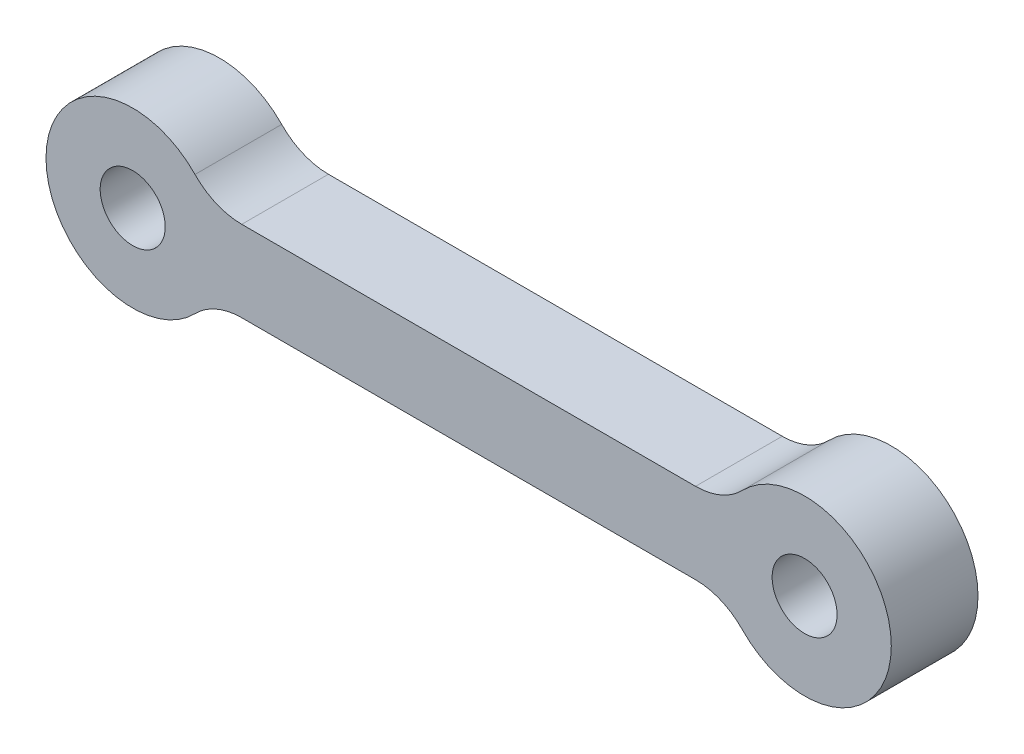
ISO-10303-21;
HEADER;
FILE_DESCRIPTION(('STEP AP214'),'2;1');
FILE_NAME('part.step','',(''),(''),'','','');
FILE_SCHEMA(('AUTOMOTIVE_DESIGN { 1 0 10303 214 1 1 1 1 }'));
ENDSEC;
DATA;
#1=APPLICATION_CONTEXT('core data for automotive mechanical design processes');
#2=APPLICATION_PROTOCOL_DEFINITION('international standard','automotive_design',2000,#1);
#3=PRODUCT_CONTEXT('',#1,'mechanical');
#4=PRODUCT('Part','Part','',(#3));
#5=PRODUCT_RELATED_PRODUCT_CATEGORY('part','',(#4));
#6=PRODUCT_DEFINITION_FORMATION('','',#4);
#7=PRODUCT_DEFINITION_CONTEXT('part definition',#1,'design');
#8=PRODUCT_DEFINITION('design','',#6,#7);
#9=PRODUCT_DEFINITION_SHAPE('','',#8);
#10=(LENGTH_UNIT() NAMED_UNIT(*) SI_UNIT(.MILLI.,.METRE.));
#11=(NAMED_UNIT(*) PLANE_ANGLE_UNIT() SI_UNIT($,.RADIAN.));
#12=(NAMED_UNIT(*) SI_UNIT($,.STERADIAN.) SOLID_ANGLE_UNIT());
#13=UNCERTAINTY_MEASURE_WITH_UNIT(LENGTH_MEASURE(1.E-05),#10,'distance_accuracy_value','');
#14=(GEOMETRIC_REPRESENTATION_CONTEXT(3) GLOBAL_UNCERTAINTY_ASSIGNED_CONTEXT((#13)) GLOBAL_UNIT_ASSIGNED_CONTEXT((#10,
#11,#12)) REPRESENTATION_CONTEXT('',''));
#15=CARTESIAN_POINT('',(0.,0.,0.));
#16=DIRECTION('',(0.,0.,1.));
#17=DIRECTION('',(1.,0.,0.));
#18=AXIS2_PLACEMENT_3D('',#15,#16,#17);
#19=CARTESIAN_POINT('',(10.4687938216451,4.86692555838731,4.));
#20=DIRECTION('',(0.,0.,1.));
#21=DIRECTION('',(1.,0.,0.));
#22=AXIS2_PLACEMENT_3D('',#19,#20,#21);
#23=PLANE('',#22);
#24=CARTESIAN_POINT('',(-15.5,0.,4.));
#25=DIRECTION('',(0.,0.,1.));
#26=DIRECTION('',(1.,0.,0.));
#27=AXIS2_PLACEMENT_3D('',#24,#25,#26);
#28=CIRCLE('',#27,1.5);
#29=CARTESIAN_POINT('',(-14.,0.,4.));
#30=VERTEX_POINT('',#29);
#31=EDGE_CURVE('E141',#30,#30,#28,.T.);
#32=ORIENTED_EDGE('',*,*,#31,.F.);
#33=EDGE_LOOP('',(#32));
#34=FACE_BOUND('',#33,.T.);
#35=CARTESIAN_POINT('',(10.4687938216451,4.86692555838731,4.));
#36=DIRECTION('',(0.,0.,-1.));
#37=DIRECTION('',(1.,0.,0.));
#38=AXIS2_PLACEMENT_3D('',#35,#36,#37);
#39=CIRCLE('',#38,3.);
#40=CARTESIAN_POINT('',(12.6250250409401,2.78110031907846,4.));
#41=VERTEX_POINT('',#40);
#42=CARTESIAN_POINT('',(10.4687938216451,1.86692555838731,4.));
#43=VERTEX_POINT('',#42);
#44=EDGE_CURVE('E152',#41,#43,#39,.T.);
#45=ORIENTED_EDGE('',*,*,#44,.T.);
#46=DIRECTION('',(-1.,0.,0.));
#47=VECTOR('',#46,1.);
#48=CARTESIAN_POINT('',(-10.4687938216451,1.86692555838731,4.));
#49=LINE('',#48,#47);
#50=CARTESIAN_POINT('',(-10.4687938216451,1.86692555838731,4.));
#51=VERTEX_POINT('',#50);
#52=EDGE_CURVE('E100',#43,#51,#49,.T.);
#53=ORIENTED_EDGE('',*,*,#52,.T.);
#54=CARTESIAN_POINT('',(-10.4687938216451,4.86692555838731,4.));
#55=DIRECTION('',(0.,0.,-1.));
#56=DIRECTION('',(-1.,0.,0.));
#57=AXIS2_PLACEMENT_3D('',#54,#55,#56);
#58=CIRCLE('',#57,3.);
#59=CARTESIAN_POINT('',(-12.6250250409401,2.78110031907846,4.));
#60=VERTEX_POINT('',#59);
#61=EDGE_CURVE('E167',#51,#60,#58,.T.);
#62=ORIENTED_EDGE('',*,*,#61,.T.);
#63=CARTESIAN_POINT('',(-15.5,0.,4.));
#64=DIRECTION('',(0.,0.,1.));
#65=DIRECTION('',(1.,0.,0.));
#66=AXIS2_PLACEMENT_3D('',#63,#64,#65);
#67=CIRCLE('',#66,4.);
#68=CARTESIAN_POINT('',(-12.6250250409401,-2.78110031907846,4.));
#69=VERTEX_POINT('',#68);
#70=EDGE_CURVE('E180',#60,#69,#67,.T.);
#71=ORIENTED_EDGE('',*,*,#70,.T.);
#72=CARTESIAN_POINT('',(-10.4687938216451,-4.86692555838731,4.));
#73=DIRECTION('',(0.,0.,-1.));
#74=DIRECTION('',(-1.,0.,0.));
#75=AXIS2_PLACEMENT_3D('',#72,#73,#74);
#76=CIRCLE('',#75,3.);
#77=CARTESIAN_POINT('',(-10.4687938216451,-1.86692555838731,4.));
#78=VERTEX_POINT('',#77);
#79=EDGE_CURVE('E119',#69,#78,#76,.T.);
#80=ORIENTED_EDGE('',*,*,#79,.T.);
#81=DIRECTION('',(1.,0.,0.));
#82=VECTOR('',#81,1.);
#83=CARTESIAN_POINT('',(-10.4687938216451,-1.86692555838731,4.));
#84=LINE('',#83,#82);
#85=CARTESIAN_POINT('',(10.4687938216451,-1.86692555838731,4.));
#86=VERTEX_POINT('',#85);
#87=EDGE_CURVE('E113',#78,#86,#84,.T.);
#88=ORIENTED_EDGE('',*,*,#87,.T.);
#89=CARTESIAN_POINT('',(10.4687938216451,-4.8669255583873,4.));
#90=DIRECTION('',(0.,0.,-1.));
#91=DIRECTION('',(-1.,0.,0.));
#92=AXIS2_PLACEMENT_3D('',#89,#90,#91);
#93=CIRCLE('',#92,3.);
#94=CARTESIAN_POINT('',(12.6250250409401,-2.78110031907846,4.));
#95=VERTEX_POINT('',#94);
#96=EDGE_CURVE('E117',#86,#95,#93,.T.);
#97=ORIENTED_EDGE('',*,*,#96,.T.);
#98=CARTESIAN_POINT('',(15.5,0.,4.));
#99=DIRECTION('',(0.,0.,1.));
#100=DIRECTION('',(-1.,0.,0.));
#101=AXIS2_PLACEMENT_3D('',#98,#99,#100);
#102=CIRCLE('',#101,4.);
#103=EDGE_CURVE('E57',#95,#41,#102,.T.);
#104=ORIENTED_EDGE('',*,*,#103,.T.);
#105=EDGE_LOOP('',(#45,#53,#62,#71,#80,#88,#97,#104));
#106=FACE_BOUND('',#105,.T.);
#107=CARTESIAN_POINT('',(15.5,0.,4.));
#108=DIRECTION('',(0.,0.,1.));
#109=DIRECTION('',(-1.,0.,0.));
#110=AXIS2_PLACEMENT_3D('',#107,#108,#109);
#111=CIRCLE('',#110,1.5);
#112=CARTESIAN_POINT('',(14.,0.,4.));
#113=VERTEX_POINT('',#112);
#114=EDGE_CURVE('E189',#113,#113,#111,.T.);
#115=ORIENTED_EDGE('',*,*,#114,.F.);
#116=EDGE_LOOP('',(#115));
#117=FACE_BOUND('',#116,.T.);
#118=ADVANCED_FACE('F40',(#34,#106,#117),#23,.T.);
#119=CARTESIAN_POINT('',(10.4687938216451,4.86692555838731,0.));
#120=DIRECTION('',(0.,0.,1.));
#121=DIRECTION('',(1.,0.,0.));
#122=AXIS2_PLACEMENT_3D('',#119,#120,#121);
#123=PLANE('',#122);
#124=CARTESIAN_POINT('',(10.4687938216451,4.86692555838731,0.));
#125=DIRECTION('',(0.,0.,-1.));
#126=DIRECTION('',(1.,0.,0.));
#127=AXIS2_PLACEMENT_3D('',#124,#125,#126);
#128=CIRCLE('',#127,3.);
#129=CARTESIAN_POINT('',(12.6250250409401,2.78110031907846,0.));
#130=VERTEX_POINT('',#129);
#131=CARTESIAN_POINT('',(10.4687938216451,1.86692555838731,0.));
#132=VERTEX_POINT('',#131);
#133=EDGE_CURVE('E137',#130,#132,#128,.T.);
#134=ORIENTED_EDGE('',*,*,#133,.F.);
#135=CARTESIAN_POINT('',(15.5,0.,0.));
#136=DIRECTION('',(0.,0.,1.));
#137=DIRECTION('',(-1.,0.,0.));
#138=AXIS2_PLACEMENT_3D('',#135,#136,#137);
#139=CIRCLE('',#138,4.);
#140=CARTESIAN_POINT('',(12.6250250409401,-2.78110031907846,0.));
#141=VERTEX_POINT('',#140);
#142=EDGE_CURVE('E92',#141,#130,#139,.T.);
#143=ORIENTED_EDGE('',*,*,#142,.F.);
#144=CARTESIAN_POINT('',(10.4687938216451,-4.8669255583873,0.));
#145=DIRECTION('',(0.,0.,-1.));
#146=DIRECTION('',(-1.,0.,0.));
#147=AXIS2_PLACEMENT_3D('',#144,#145,#146);
#148=CIRCLE('',#147,3.);
#149=CARTESIAN_POINT('',(10.4687938216451,-1.86692555838731,0.));
#150=VERTEX_POINT('',#149);
#151=EDGE_CURVE('E86',#150,#141,#148,.T.);
#152=ORIENTED_EDGE('',*,*,#151,.F.);
#153=DIRECTION('',(1.,0.,0.));
#154=VECTOR('',#153,1.);
#155=CARTESIAN_POINT('',(-10.4687938216451,-1.86692555838731,0.));
#156=LINE('',#155,#154);
#157=CARTESIAN_POINT('',(-10.4687938216451,-1.86692555838731,0.));
#158=VERTEX_POINT('',#157);
#159=EDGE_CURVE('E127',#158,#150,#156,.T.);
#160=ORIENTED_EDGE('',*,*,#159,.F.);
#161=CARTESIAN_POINT('',(-10.4687938216451,-4.86692555838731,0.));
#162=DIRECTION('',(0.,0.,-1.));
#163=DIRECTION('',(-1.,0.,0.));
#164=AXIS2_PLACEMENT_3D('',#161,#162,#163);
#165=CIRCLE('',#164,3.);
#166=CARTESIAN_POINT('',(-12.6250250409401,-2.78110031907846,0.));
#167=VERTEX_POINT('',#166);
#168=EDGE_CURVE('E147',#167,#158,#165,.T.);
#169=ORIENTED_EDGE('',*,*,#168,.F.);
#170=CARTESIAN_POINT('',(-15.5,0.,0.));
#171=DIRECTION('',(0.,0.,1.));
#172=DIRECTION('',(1.,0.,0.));
#173=AXIS2_PLACEMENT_3D('',#170,#171,#172);
#174=CIRCLE('',#173,4.);
#175=CARTESIAN_POINT('',(-12.6250250409401,2.78110031907846,0.));
#176=VERTEX_POINT('',#175);
#177=EDGE_CURVE('E145',#176,#167,#174,.T.);
#178=ORIENTED_EDGE('',*,*,#177,.F.);
#179=CARTESIAN_POINT('',(-10.4687938216451,4.86692555838731,0.));
#180=DIRECTION('',(0.,0.,-1.));
#181=DIRECTION('',(-1.,0.,0.));
#182=AXIS2_PLACEMENT_3D('',#179,#180,#181);
#183=CIRCLE('',#182,3.);
#184=CARTESIAN_POINT('',(-10.4687938216451,1.86692555838731,0.));
#185=VERTEX_POINT('',#184);
#186=EDGE_CURVE('E143',#185,#176,#183,.T.);
#187=ORIENTED_EDGE('',*,*,#186,.F.);
#188=DIRECTION('',(-1.,0.,0.));
#189=VECTOR('',#188,1.);
#190=CARTESIAN_POINT('',(-10.4687938216451,1.86692555838731,0.));
#191=LINE('',#190,#189);
#192=EDGE_CURVE('E140',#132,#185,#191,.T.);
#193=ORIENTED_EDGE('',*,*,#192,.F.);
#194=EDGE_LOOP('',(#134,#143,#152,#160,#169,#178,#187,#193));
#195=FACE_BOUND('',#194,.T.);
#196=CARTESIAN_POINT('',(-15.5,0.,0.));
#197=DIRECTION('',(0.,0.,1.));
#198=DIRECTION('',(1.,0.,0.));
#199=AXIS2_PLACEMENT_3D('',#196,#197,#198);
#200=CIRCLE('',#199,1.5);
#201=CARTESIAN_POINT('',(-14.,0.,0.));
#202=VERTEX_POINT('',#201);
#203=EDGE_CURVE('E186',#202,#202,#200,.T.);
#204=ORIENTED_EDGE('',*,*,#203,.T.);
#205=EDGE_LOOP('',(#204));
#206=FACE_BOUND('',#205,.T.);
#207=CARTESIAN_POINT('',(15.5,0.,0.));
#208=DIRECTION('',(0.,0.,1.));
#209=DIRECTION('',(-1.,0.,0.));
#210=AXIS2_PLACEMENT_3D('',#207,#208,#209);
#211=CIRCLE('',#210,1.5);
#212=CARTESIAN_POINT('',(14.,0.,0.));
#213=VERTEX_POINT('',#212);
#214=EDGE_CURVE('E192',#213,#213,#211,.T.);
#215=ORIENTED_EDGE('',*,*,#214,.T.);
#216=EDGE_LOOP('',(#215));
#217=FACE_BOUND('',#216,.T.);
#218=ADVANCED_FACE('F171',(#195,#206,#217),#123,.F.);
#219=CARTESIAN_POINT('',(10.4687938216451,4.86692555838731,4.));
#220=DIRECTION('',(0.,0.,-1.));
#221=DIRECTION('',(-1.,0.,0.));
#222=AXIS2_PLACEMENT_3D('',#219,#220,#221);
#223=CYLINDRICAL_SURFACE('',#222,3.);
#224=ORIENTED_EDGE('',*,*,#133,.T.);
#225=DIRECTION('',(0.,0.,-1.));
#226=VECTOR('',#225,1.);
#227=CARTESIAN_POINT('',(10.4687938216451,1.86692555838731,4.));
#228=LINE('',#227,#226);
#229=EDGE_CURVE('E11',#43,#132,#228,.T.);
#230=ORIENTED_EDGE('',*,*,#229,.F.);
#231=ORIENTED_EDGE('',*,*,#44,.F.);
#232=DIRECTION('',(0.,0.,-1.));
#233=VECTOR('',#232,1.);
#234=CARTESIAN_POINT('',(12.6250250409401,2.78110031907846,4.));
#235=LINE('',#234,#233);
#236=EDGE_CURVE('E133',#41,#130,#235,.T.);
#237=ORIENTED_EDGE('',*,*,#236,.T.);
#238=EDGE_LOOP('',(#224,#230,#231,#237));
#239=FACE_BOUND('',#238,.T.);
#240=ADVANCED_FACE('F42',(#239),#223,.F.);
#241=CARTESIAN_POINT('',(-10.4687938216451,1.86692555838731,4.));
#242=DIRECTION('',(0.,-1.,0.));
#243=DIRECTION('',(0.,0.,-1.));
#244=AXIS2_PLACEMENT_3D('',#241,#242,#243);
#245=PLANE('',#244);
#246=ORIENTED_EDGE('',*,*,#192,.T.);
#247=DIRECTION('',(0.,0.,-1.));
#248=VECTOR('',#247,1.);
#249=CARTESIAN_POINT('',(-10.4687938216451,1.86692555838731,4.));
#250=LINE('',#249,#248);
#251=EDGE_CURVE('E49',#51,#185,#250,.T.);
#252=ORIENTED_EDGE('',*,*,#251,.F.);
#253=ORIENTED_EDGE('',*,*,#52,.F.);
#254=ORIENTED_EDGE('',*,*,#229,.T.);
#255=EDGE_LOOP('',(#246,#252,#253,#254));
#256=FACE_BOUND('',#255,.T.);
#257=ADVANCED_FACE('F224',(#256),#245,.F.);
#258=CARTESIAN_POINT('',(-10.4687938216451,4.86692555838731,4.));
#259=DIRECTION('',(0.,0.,-1.));
#260=DIRECTION('',(-1.,0.,0.));
#261=AXIS2_PLACEMENT_3D('',#258,#259,#260);
#262=CYLINDRICAL_SURFACE('',#261,3.);
#263=ORIENTED_EDGE('',*,*,#186,.T.);
#264=DIRECTION('',(0.,0.,-1.));
#265=VECTOR('',#264,1.);
#266=CARTESIAN_POINT('',(-12.6250250409401,2.78110031907846,4.));
#267=LINE('',#266,#265);
#268=EDGE_CURVE('E159',#60,#176,#267,.T.);
#269=ORIENTED_EDGE('',*,*,#268,.F.);
#270=ORIENTED_EDGE('',*,*,#61,.F.);
#271=ORIENTED_EDGE('',*,*,#251,.T.);
#272=EDGE_LOOP('',(#263,#269,#270,#271));
#273=FACE_BOUND('',#272,.T.);
#274=ADVANCED_FACE('F165',(#273),#262,.F.);
#275=CARTESIAN_POINT('',(-15.5,0.,4.));
#276=DIRECTION('',(0.,0.,-1.));
#277=DIRECTION('',(-1.,0.,0.));
#278=AXIS2_PLACEMENT_3D('',#275,#276,#277);
#279=CYLINDRICAL_SURFACE('',#278,4.);
#280=ORIENTED_EDGE('',*,*,#177,.T.);
#281=DIRECTION('',(0.,0.,-1.));
#282=VECTOR('',#281,1.);
#283=CARTESIAN_POINT('',(-12.6250250409401,-2.78110031907846,4.));
#284=LINE('',#283,#282);
#285=EDGE_CURVE('E156',#69,#167,#284,.T.);
#286=ORIENTED_EDGE('',*,*,#285,.F.);
#287=ORIENTED_EDGE('',*,*,#70,.F.);
#288=ORIENTED_EDGE('',*,*,#268,.T.);
#289=EDGE_LOOP('',(#280,#286,#287,#288));
#290=FACE_BOUND('',#289,.T.);
#291=ADVANCED_FACE('F176',(#290),#279,.T.);
#292=CARTESIAN_POINT('',(-10.4687938216451,-4.86692555838731,4.));
#293=DIRECTION('',(0.,0.,-1.));
#294=DIRECTION('',(-1.,0.,0.));
#295=AXIS2_PLACEMENT_3D('',#292,#293,#294);
#296=CYLINDRICAL_SURFACE('',#295,3.);
#297=ORIENTED_EDGE('',*,*,#168,.T.);
#298=DIRECTION('',(0.,0.,-1.));
#299=VECTOR('',#298,1.);
#300=CARTESIAN_POINT('',(-10.4687938216451,-1.86692555838731,4.));
#301=LINE('',#300,#299);
#302=EDGE_CURVE('E128',#78,#158,#301,.T.);
#303=ORIENTED_EDGE('',*,*,#302,.F.);
#304=ORIENTED_EDGE('',*,*,#79,.F.);
#305=ORIENTED_EDGE('',*,*,#285,.T.);
#306=EDGE_LOOP('',(#297,#303,#304,#305));
#307=FACE_BOUND('',#306,.T.);
#308=ADVANCED_FACE('F179',(#307),#296,.F.);
#309=CARTESIAN_POINT('',(-10.4687938216451,-1.86692555838731,4.));
#310=DIRECTION('',(0.,1.,0.));
#311=DIRECTION('',(0.,0.,1.));
#312=AXIS2_PLACEMENT_3D('',#309,#310,#311);
#313=PLANE('',#312);
#314=ORIENTED_EDGE('',*,*,#159,.T.);
#315=DIRECTION('',(0.,0.,-1.));
#316=VECTOR('',#315,1.);
#317=CARTESIAN_POINT('',(10.4687938216451,-1.86692555838731,4.));
#318=LINE('',#317,#316);
#319=EDGE_CURVE('E124',#86,#150,#318,.T.);
#320=ORIENTED_EDGE('',*,*,#319,.F.);
#321=ORIENTED_EDGE('',*,*,#87,.F.);
#322=ORIENTED_EDGE('',*,*,#302,.T.);
#323=EDGE_LOOP('',(#314,#320,#321,#322));
#324=FACE_BOUND('',#323,.T.);
#325=ADVANCED_FACE('F125',(#324),#313,.F.);
#326=CARTESIAN_POINT('',(10.4687938216451,-4.8669255583873,4.));
#327=DIRECTION('',(0.,0.,-1.));
#328=DIRECTION('',(-1.,0.,0.));
#329=AXIS2_PLACEMENT_3D('',#326,#327,#328);
#330=CYLINDRICAL_SURFACE('',#329,3.);
#331=ORIENTED_EDGE('',*,*,#151,.T.);
#332=DIRECTION('',(0.,0.,-1.));
#333=VECTOR('',#332,1.);
#334=CARTESIAN_POINT('',(12.6250250409401,-2.78110031907846,4.));
#335=LINE('',#334,#333);
#336=EDGE_CURVE('E129',#95,#141,#335,.T.);
#337=ORIENTED_EDGE('',*,*,#336,.F.);
#338=ORIENTED_EDGE('',*,*,#96,.F.);
#339=ORIENTED_EDGE('',*,*,#319,.T.);
#340=EDGE_LOOP('',(#331,#337,#338,#339));
#341=FACE_BOUND('',#340,.T.);
#342=ADVANCED_FACE('F131',(#341),#330,.F.);
#343=CARTESIAN_POINT('',(15.5,0.,4.));
#344=DIRECTION('',(0.,0.,-1.));
#345=DIRECTION('',(-1.,0.,0.));
#346=AXIS2_PLACEMENT_3D('',#343,#344,#345);
#347=CYLINDRICAL_SURFACE('',#346,4.);
#348=ORIENTED_EDGE('',*,*,#142,.T.);
#349=ORIENTED_EDGE('',*,*,#236,.F.);
#350=ORIENTED_EDGE('',*,*,#103,.F.);
#351=ORIENTED_EDGE('',*,*,#336,.T.);
#352=EDGE_LOOP('',(#348,#349,#350,#351));
#353=FACE_BOUND('',#352,.T.);
#354=ADVANCED_FACE('F212',(#353),#347,.T.);
#355=CARTESIAN_POINT('',(-15.5,0.,4.));
#356=DIRECTION('',(0.,0.,-1.));
#357=DIRECTION('',(-1.,0.,0.));
#358=AXIS2_PLACEMENT_3D('',#355,#356,#357);
#359=CYLINDRICAL_SURFACE('',#358,1.5);
#360=ORIENTED_EDGE('',*,*,#31,.T.);
#361=EDGE_LOOP('',(#360));
#362=FACE_BOUND('',#361,.T.);
#363=ORIENTED_EDGE('',*,*,#203,.F.);
#364=EDGE_LOOP('',(#363));
#365=FACE_BOUND('',#364,.T.);
#366=ADVANCED_FACE('F209',(#362,#365),#359,.F.);
#367=CARTESIAN_POINT('',(15.5,0.,4.));
#368=DIRECTION('',(0.,0.,-1.));
#369=DIRECTION('',(-1.,0.,0.));
#370=AXIS2_PLACEMENT_3D('',#367,#368,#369);
#371=CYLINDRICAL_SURFACE('',#370,1.5);
#372=ORIENTED_EDGE('',*,*,#114,.T.);
#373=EDGE_LOOP('',(#372));
#374=FACE_BOUND('',#373,.T.);
#375=ORIENTED_EDGE('',*,*,#214,.F.);
#376=EDGE_LOOP('',(#375));
#377=FACE_BOUND('',#376,.T.);
#378=ADVANCED_FACE('F198',(#374,#377),#371,.F.);
#379=CLOSED_SHELL('',(#118,#218,#240,#257,#274,#291,#308,#325,#342,#354,#366,#378));
#380=MANIFOLD_SOLID_BREP('B2',#379);
#381=ADVANCED_BREP_SHAPE_REPRESENTATION('',(#18,#380),#14);
#382=SHAPE_DEFINITION_REPRESENTATION(#9,#381);
ENDSEC;
END-ISO-10303-21;
